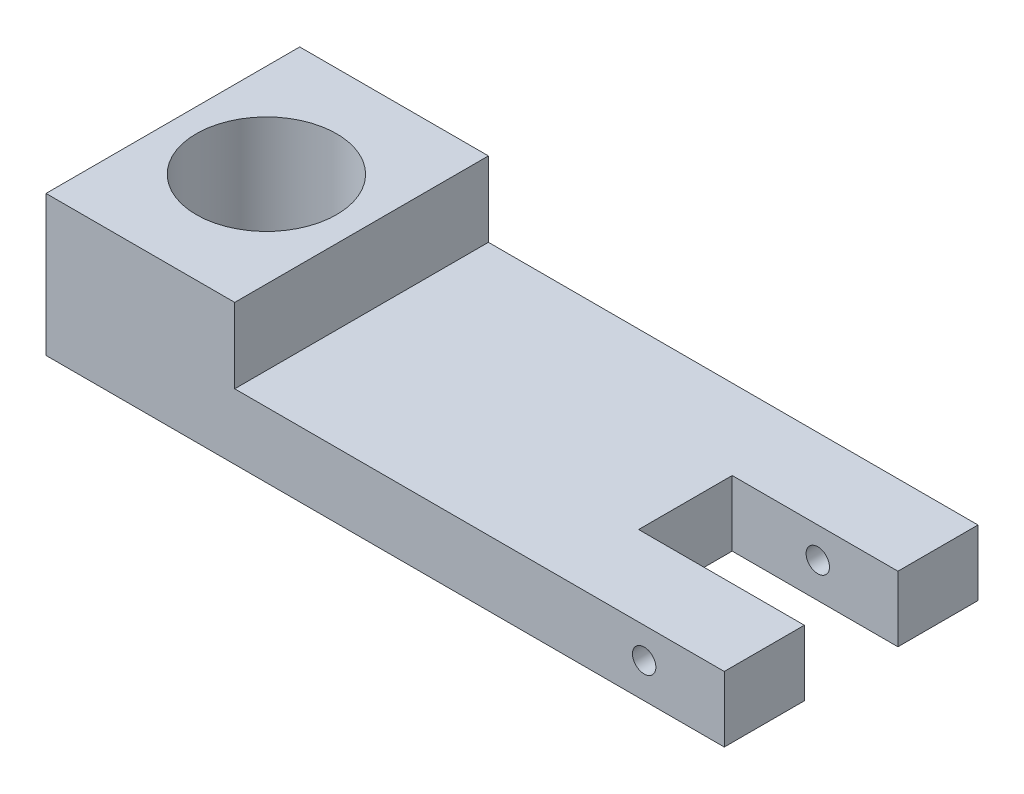
ISO-10303-21;
HEADER;
FILE_DESCRIPTION(('STEP AP214'),'2;1');
FILE_NAME('part.step','',(''),(''),'','','');
FILE_SCHEMA(('AUTOMOTIVE_DESIGN { 1 0 10303 214 1 1 1 1 }'));
ENDSEC;
DATA;
#1=APPLICATION_CONTEXT('core data for automotive mechanical design processes');
#2=APPLICATION_PROTOCOL_DEFINITION('international standard','automotive_design',2000,#1);
#3=PRODUCT_CONTEXT('',#1,'mechanical');
#4=PRODUCT('Part','Part','',(#3));
#5=PRODUCT_RELATED_PRODUCT_CATEGORY('part','',(#4));
#6=PRODUCT_DEFINITION_FORMATION('','',#4);
#7=PRODUCT_DEFINITION_CONTEXT('part definition',#1,'design');
#8=PRODUCT_DEFINITION('design','',#6,#7);
#9=PRODUCT_DEFINITION_SHAPE('','',#8);
#10=(LENGTH_UNIT() NAMED_UNIT(*) SI_UNIT(.MILLI.,.METRE.));
#11=(NAMED_UNIT(*) PLANE_ANGLE_UNIT() SI_UNIT($,.RADIAN.));
#12=(NAMED_UNIT(*) SI_UNIT($,.STERADIAN.) SOLID_ANGLE_UNIT());
#13=UNCERTAINTY_MEASURE_WITH_UNIT(LENGTH_MEASURE(1.E-05),#10,'distance_accuracy_value','');
#14=(GEOMETRIC_REPRESENTATION_CONTEXT(3) GLOBAL_UNCERTAINTY_ASSIGNED_CONTEXT((#13)) GLOBAL_UNIT_ASSIGNED_CONTEXT((#10,
#11,#12)) REPRESENTATION_CONTEXT('',''));
#15=CARTESIAN_POINT('',(0.,0.,0.));
#16=DIRECTION('',(0.,0.,1.));
#17=DIRECTION('',(1.,0.,0.));
#18=AXIS2_PLACEMENT_3D('',#15,#16,#17);
#19=CARTESIAN_POINT('',(125.,14.,27.1195704816793));
#20=DIRECTION('',(0.,1.,0.));
#21=DIRECTION('',(0.,0.,1.));
#22=AXIS2_PLACEMENT_3D('',#19,#20,#21);
#23=PLANE('',#22);
#24=DIRECTION('',(0.,0.,-1.));
#25=VECTOR('',#24,1.);
#26=CARTESIAN_POINT('',(20.3424895799387,14.,27.1195704816793));
#27=LINE('',#26,#25);
#28=CARTESIAN_POINT('',(20.3424895799387,14.,27.1195704816793));
#29=VERTEX_POINT('',#28);
#30=CARTESIAN_POINT('',(20.3424895799387,14.,-27.1195704816591));
#31=VERTEX_POINT('',#30);
#32=EDGE_CURVE('E50',#29,#31,#27,.T.);
#33=ORIENTED_EDGE('',*,*,#32,.F.);
#34=DIRECTION('',(1.,0.,0.));
#35=VECTOR('',#34,1.);
#36=CARTESIAN_POINT('',(-20.,14.,27.1195704816793));
#37=LINE('',#36,#35);
#38=CARTESIAN_POINT('',(125.,14.,27.1195704816793));
#39=VERTEX_POINT('',#38);
#40=EDGE_CURVE('E153',#29,#39,#37,.T.);
#41=ORIENTED_EDGE('',*,*,#40,.T.);
#42=DIRECTION('',(0.,0.,-1.));
#43=VECTOR('',#42,1.);
#44=CARTESIAN_POINT('',(125.,14.,-27.1195704816591));
#45=LINE('',#44,#43);
#46=CARTESIAN_POINT('',(125.,14.,9.99999999999989));
#47=VERTEX_POINT('',#46);
#48=EDGE_CURVE('E170',#39,#47,#45,.T.);
#49=ORIENTED_EDGE('',*,*,#48,.T.);
#50=DIRECTION('',(-1.,0.,0.));
#51=VECTOR('',#50,1.);
#52=CARTESIAN_POINT('',(125.,14.,9.99999999999989));
#53=LINE('',#52,#51);
#54=CARTESIAN_POINT('',(89.5690146557837,14.,9.99999999999989));
#55=VERTEX_POINT('',#54);
#56=EDGE_CURVE('E58',#47,#55,#53,.T.);
#57=ORIENTED_EDGE('',*,*,#56,.T.);
#58=DIRECTION('',(0.,0.,-1.));
#59=VECTOR('',#58,1.);
#60=CARTESIAN_POINT('',(89.5690146557837,14.,27.1195704816793));
#61=LINE('',#60,#59);
#62=CARTESIAN_POINT('',(89.5690146557837,14.,-10.0000000000001));
#63=VERTEX_POINT('',#62);
#64=EDGE_CURVE('E220',#55,#63,#61,.T.);
#65=ORIENTED_EDGE('',*,*,#64,.T.);
#66=DIRECTION('',(1.,0.,0.));
#67=VECTOR('',#66,1.);
#68=CARTESIAN_POINT('',(125.,14.,-10.0000000000001));
#69=LINE('',#68,#67);
#70=CARTESIAN_POINT('',(125.,14.,-10.0000000000001));
#71=VERTEX_POINT('',#70);
#72=EDGE_CURVE('E224',#63,#71,#69,.T.);
#73=ORIENTED_EDGE('',*,*,#72,.T.);
#74=CARTESIAN_POINT('',(125.,14.,-27.1195704816591));
#75=VERTEX_POINT('',#74);
#76=EDGE_CURVE('E185',#71,#75,#45,.T.);
#77=ORIENTED_EDGE('',*,*,#76,.T.);
#78=DIRECTION('',(-1.,0.,0.));
#79=VECTOR('',#78,1.);
#80=CARTESIAN_POINT('',(-20.,14.,-27.1195704816591));
#81=LINE('',#80,#79);
#82=EDGE_CURVE('E168',#75,#31,#81,.T.);
#83=ORIENTED_EDGE('',*,*,#82,.T.);
#84=EDGE_LOOP('',(#33,#41,#49,#57,#65,#73,#77,#83));
#85=FACE_BOUND('',#84,.T.);
#86=ADVANCED_FACE('F33',(#85),#23,.T.);
#87=CARTESIAN_POINT('',(125.,0.,27.1195704816793));
#88=DIRECTION('',(0.,1.,0.));
#89=DIRECTION('',(0.,0.,1.));
#90=AXIS2_PLACEMENT_3D('',#87,#88,#89);
#91=PLANE('',#90);
#92=CARTESIAN_POINT('',(0.,0.,0.));
#93=DIRECTION('',(0.,1.,0.));
#94=DIRECTION('',(0.,0.,1.));
#95=AXIS2_PLACEMENT_3D('',#92,#93,#94);
#96=CIRCLE('',#95,15.);
#97=CARTESIAN_POINT('',(0.,0.,15.));
#98=VERTEX_POINT('',#97);
#99=EDGE_CURVE('E218',#98,#98,#96,.T.);
#100=ORIENTED_EDGE('',*,*,#99,.T.);
#101=EDGE_LOOP('',(#100));
#102=FACE_BOUND('',#101,.T.);
#103=DIRECTION('',(-1.,0.,0.));
#104=VECTOR('',#103,1.);
#105=CARTESIAN_POINT('',(89.5690146557837,0.,-10.0000000000001));
#106=LINE('',#105,#104);
#107=CARTESIAN_POINT('',(125.,0.,-10.0000000000001));
#108=VERTEX_POINT('',#107);
#109=CARTESIAN_POINT('',(89.5690146557837,0.,-10.0000000000001));
#110=VERTEX_POINT('',#109);
#111=EDGE_CURVE('E234',#108,#110,#106,.T.);
#112=ORIENTED_EDGE('',*,*,#111,.T.);
#113=DIRECTION('',(0.,0.,1.));
#114=VECTOR('',#113,1.);
#115=CARTESIAN_POINT('',(89.5690146557837,0.,9.99999999999989));
#116=LINE('',#115,#114);
#117=CARTESIAN_POINT('',(89.5690146557837,0.,9.99999999999989));
#118=VERTEX_POINT('',#117);
#119=EDGE_CURVE('E204',#110,#118,#116,.T.);
#120=ORIENTED_EDGE('',*,*,#119,.T.);
#121=DIRECTION('',(1.,0.,0.));
#122=VECTOR('',#121,1.);
#123=CARTESIAN_POINT('',(89.5690146557837,0.,9.99999999999989));
#124=LINE('',#123,#122);
#125=CARTESIAN_POINT('',(125.,0.,9.99999999999989));
#126=VERTEX_POINT('',#125);
#127=EDGE_CURVE('E194',#118,#126,#124,.T.);
#128=ORIENTED_EDGE('',*,*,#127,.T.);
#129=DIRECTION('',(0.,0.,-1.));
#130=VECTOR('',#129,1.);
#131=CARTESIAN_POINT('',(125.,0.,-27.1195704816591));
#132=LINE('',#131,#130);
#133=CARTESIAN_POINT('',(125.,0.,27.1195704816793));
#134=VERTEX_POINT('',#133);
#135=EDGE_CURVE('E176',#134,#126,#132,.T.);
#136=ORIENTED_EDGE('',*,*,#135,.F.);
#137=DIRECTION('',(1.,0.,0.));
#138=VECTOR('',#137,1.);
#139=CARTESIAN_POINT('',(-20.,0.,27.1195704816793));
#140=LINE('',#139,#138);
#141=CARTESIAN_POINT('',(-20.,0.,27.1195704816793));
#142=VERTEX_POINT('',#141);
#143=EDGE_CURVE('E183',#142,#134,#140,.T.);
#144=ORIENTED_EDGE('',*,*,#143,.F.);
#145=DIRECTION('',(0.,0.,1.));
#146=VECTOR('',#145,1.);
#147=CARTESIAN_POINT('',(-20.,0.,-27.1195704816591));
#148=LINE('',#147,#146);
#149=CARTESIAN_POINT('',(-20.,0.,-27.1195704816591));
#150=VERTEX_POINT('',#149);
#151=EDGE_CURVE('E119',#150,#142,#148,.T.);
#152=ORIENTED_EDGE('',*,*,#151,.F.);
#153=DIRECTION('',(-1.,0.,0.));
#154=VECTOR('',#153,1.);
#155=CARTESIAN_POINT('',(-20.,0.,-27.1195704816591));
#156=LINE('',#155,#154);
#157=CARTESIAN_POINT('',(125.,0.,-27.1195704816591));
#158=VERTEX_POINT('',#157);
#159=EDGE_CURVE('E179',#158,#150,#156,.T.);
#160=ORIENTED_EDGE('',*,*,#159,.F.);
#161=EDGE_CURVE('E180',#108,#158,#132,.T.);
#162=ORIENTED_EDGE('',*,*,#161,.F.);
#163=EDGE_LOOP('',(#112,#120,#128,#136,#144,#152,#160,#162));
#164=FACE_BOUND('',#163,.T.);
#165=ADVANCED_FACE('F202',(#102,#164),#91,.F.);
#166=CARTESIAN_POINT('',(125.,14.,-27.1195704816591));
#167=DIRECTION('',(-1.,0.,0.));
#168=DIRECTION('',(0.,0.,1.));
#169=AXIS2_PLACEMENT_3D('',#166,#167,#168);
#170=PLANE('',#169);
#171=DIRECTION('',(0.,1.,0.));
#172=VECTOR('',#171,1.);
#173=CARTESIAN_POINT('',(125.,14.,-10.0000000000001));
#174=LINE('',#173,#172);
#175=EDGE_CURVE('E11',#108,#71,#174,.T.);
#176=ORIENTED_EDGE('',*,*,#175,.F.);
#177=ORIENTED_EDGE('',*,*,#161,.T.);
#178=DIRECTION('',(0.,-1.,0.));
#179=VECTOR('',#178,1.);
#180=CARTESIAN_POINT('',(125.,14.,-27.1195704816591));
#181=LINE('',#180,#179);
#182=EDGE_CURVE('E189',#75,#158,#181,.T.);
#183=ORIENTED_EDGE('',*,*,#182,.F.);
#184=ORIENTED_EDGE('',*,*,#76,.F.);
#185=EDGE_LOOP('',(#176,#177,#183,#184));
#186=FACE_BOUND('',#185,.T.);
#187=ADVANCED_FACE('F35',(#186),#170,.F.);
#188=DIRECTION('',(0.,-1.,0.));
#189=VECTOR('',#188,1.);
#190=CARTESIAN_POINT('',(125.,14.,9.99999999999989));
#191=LINE('',#190,#189);
#192=EDGE_CURVE('E42',#47,#126,#191,.T.);
#193=ORIENTED_EDGE('',*,*,#192,.F.);
#194=ORIENTED_EDGE('',*,*,#48,.F.);
#195=DIRECTION('',(0.,-1.,0.));
#196=VECTOR('',#195,1.);
#197=CARTESIAN_POINT('',(125.,14.,27.1195704816793));
#198=LINE('',#197,#196);
#199=EDGE_CURVE('E123',#39,#134,#198,.T.);
#200=ORIENTED_EDGE('',*,*,#199,.T.);
#201=ORIENTED_EDGE('',*,*,#135,.T.);
#202=EDGE_LOOP('',(#193,#194,#200,#201));
#203=FACE_BOUND('',#202,.T.);
#204=ADVANCED_FACE('F207',(#203),#170,.F.);
#205=CARTESIAN_POINT('',(-20.,14.,-27.1195704816591));
#206=DIRECTION('',(0.,0.,1.));
#207=DIRECTION('',(1.,0.,0.));
#208=AXIS2_PLACEMENT_3D('',#205,#206,#207);
#209=PLANE('',#208);
#210=CARTESIAN_POINT('',(107.871367234566,7.46112959486413,-27.1195704816591));
#211=DIRECTION('',(0.,0.,1.));
#212=DIRECTION('',(1.,0.,0.));
#213=AXIS2_PLACEMENT_3D('',#210,#211,#212);
#214=CIRCLE('',#213,2.49999999999999);
#215=CARTESIAN_POINT('',(110.371367234566,7.46112959486413,-27.1195704816591));
#216=VERTEX_POINT('',#215);
#217=EDGE_CURVE('E236',#216,#216,#214,.T.);
#218=ORIENTED_EDGE('',*,*,#217,.T.);
#219=EDGE_LOOP('',(#218));
#220=FACE_BOUND('',#219,.T.);
#221=ORIENTED_EDGE('',*,*,#159,.T.);
#222=DIRECTION('',(0.,-1.,0.));
#223=VECTOR('',#222,1.);
#224=CARTESIAN_POINT('',(-20.,14.,-27.1195704816591));
#225=LINE('',#224,#223);
#226=CARTESIAN_POINT('',(-20.,30.,-27.1195704816591));
#227=VERTEX_POINT('',#226);
#228=EDGE_CURVE('E122',#227,#150,#225,.T.);
#229=ORIENTED_EDGE('',*,*,#228,.F.);
#230=DIRECTION('',(-1.,0.,0.));
#231=VECTOR('',#230,1.);
#232=CARTESIAN_POINT('',(-20.,30.,-27.1195704816591));
#233=LINE('',#232,#231);
#234=CARTESIAN_POINT('',(20.3424895799387,30.,-27.1195704816591));
#235=VERTEX_POINT('',#234);
#236=EDGE_CURVE('E138',#235,#227,#233,.T.);
#237=ORIENTED_EDGE('',*,*,#236,.F.);
#238=DIRECTION('',(0.,-1.,0.));
#239=VECTOR('',#238,1.);
#240=CARTESIAN_POINT('',(20.3424895799387,30.,-27.1195704816591));
#241=LINE('',#240,#239);
#242=EDGE_CURVE('E146',#235,#31,#241,.T.);
#243=ORIENTED_EDGE('',*,*,#242,.T.);
#244=ORIENTED_EDGE('',*,*,#82,.F.);
#245=ORIENTED_EDGE('',*,*,#182,.T.);
#246=EDGE_LOOP('',(#221,#229,#237,#243,#244,#245));
#247=FACE_BOUND('',#246,.T.);
#248=ADVANCED_FACE('F214',(#220,#247),#209,.F.);
#249=CARTESIAN_POINT('',(-20.,14.,-27.1195704816591));
#250=DIRECTION('',(1.,0.,0.));
#251=DIRECTION('',(0.,0.,-1.));
#252=AXIS2_PLACEMENT_3D('',#249,#250,#251);
#253=PLANE('',#252);
#254=ORIENTED_EDGE('',*,*,#151,.T.);
#255=DIRECTION('',(0.,-1.,0.));
#256=VECTOR('',#255,1.);
#257=CARTESIAN_POINT('',(-20.,14.,27.1195704816793));
#258=LINE('',#257,#256);
#259=CARTESIAN_POINT('',(-20.,30.,27.1195704816793));
#260=VERTEX_POINT('',#259);
#261=EDGE_CURVE('E112',#260,#142,#258,.T.);
#262=ORIENTED_EDGE('',*,*,#261,.F.);
#263=DIRECTION('',(0.,0.,1.));
#264=VECTOR('',#263,1.);
#265=CARTESIAN_POINT('',(-20.,30.,27.1195704816793));
#266=LINE('',#265,#264);
#267=EDGE_CURVE('E117',#227,#260,#266,.T.);
#268=ORIENTED_EDGE('',*,*,#267,.F.);
#269=ORIENTED_EDGE('',*,*,#228,.T.);
#270=EDGE_LOOP('',(#254,#262,#268,#269));
#271=FACE_BOUND('',#270,.T.);
#272=ADVANCED_FACE('F114',(#271),#253,.F.);
#273=CARTESIAN_POINT('',(-20.,14.,27.1195704816793));
#274=DIRECTION('',(0.,0.,-1.));
#275=DIRECTION('',(-1.,0.,0.));
#276=AXIS2_PLACEMENT_3D('',#273,#274,#275);
#277=PLANE('',#276);
#278=CARTESIAN_POINT('',(107.871367234566,7.46112959486413,27.1195704816793));
#279=DIRECTION('',(0.,0.,-1.));
#280=DIRECTION('',(-1.,0.,0.));
#281=AXIS2_PLACEMENT_3D('',#278,#279,#280);
#282=CIRCLE('',#281,2.49999999999999);
#283=CARTESIAN_POINT('',(105.371367234566,7.46112959486413,27.1195704816793));
#284=VERTEX_POINT('',#283);
#285=EDGE_CURVE('E166',#284,#284,#282,.T.);
#286=ORIENTED_EDGE('',*,*,#285,.T.);
#287=EDGE_LOOP('',(#286));
#288=FACE_BOUND('',#287,.T.);
#289=ORIENTED_EDGE('',*,*,#143,.T.);
#290=ORIENTED_EDGE('',*,*,#199,.F.);
#291=ORIENTED_EDGE('',*,*,#40,.F.);
#292=DIRECTION('',(0.,-1.,0.));
#293=VECTOR('',#292,1.);
#294=CARTESIAN_POINT('',(20.3424895799387,30.,27.1195704816793));
#295=LINE('',#294,#293);
#296=CARTESIAN_POINT('',(20.3424895799387,30.,27.1195704816793));
#297=VERTEX_POINT('',#296);
#298=EDGE_CURVE('E129',#297,#29,#295,.T.);
#299=ORIENTED_EDGE('',*,*,#298,.F.);
#300=DIRECTION('',(1.,0.,0.));
#301=VECTOR('',#300,1.);
#302=CARTESIAN_POINT('',(-20.,30.,27.1195704816793));
#303=LINE('',#302,#301);
#304=EDGE_CURVE('E126',#260,#297,#303,.T.);
#305=ORIENTED_EDGE('',*,*,#304,.F.);
#306=ORIENTED_EDGE('',*,*,#261,.T.);
#307=EDGE_LOOP('',(#289,#290,#291,#299,#305,#306));
#308=FACE_BOUND('',#307,.T.);
#309=ADVANCED_FACE('F127',(#288,#308),#277,.F.);
#310=CARTESIAN_POINT('',(0.,14.,0.));
#311=DIRECTION('',(0.,-1.,0.));
#312=DIRECTION('',(0.,0.,-1.));
#313=AXIS2_PLACEMENT_3D('',#310,#311,#312);
#314=CYLINDRICAL_SURFACE('',#313,15.);
#315=ORIENTED_EDGE('',*,*,#99,.F.);
#316=EDGE_LOOP('',(#315));
#317=FACE_BOUND('',#316,.T.);
#318=CARTESIAN_POINT('',(0.,30.,0.));
#319=DIRECTION('',(0.,1.,0.));
#320=DIRECTION('',(0.,0.,1.));
#321=AXIS2_PLACEMENT_3D('',#318,#319,#320);
#322=CIRCLE('',#321,15.);
#323=CARTESIAN_POINT('',(0.,30.,15.));
#324=VERTEX_POINT('',#323);
#325=EDGE_CURVE('E140',#324,#324,#322,.T.);
#326=ORIENTED_EDGE('',*,*,#325,.T.);
#327=EDGE_LOOP('',(#326));
#328=FACE_BOUND('',#327,.T.);
#329=ADVANCED_FACE('F262',(#317,#328),#314,.F.);
#330=CARTESIAN_POINT('',(89.5690146557837,50.,-10.0000000000001));
#331=DIRECTION('',(0.,0.,1.));
#332=DIRECTION('',(1.,0.,0.));
#333=AXIS2_PLACEMENT_3D('',#330,#331,#332);
#334=PLANE('',#333);
#335=CARTESIAN_POINT('',(107.871367234566,7.46112959486413,-10.0000000000001));
#336=DIRECTION('',(0.,0.,1.));
#337=DIRECTION('',(1.,0.,0.));
#338=AXIS2_PLACEMENT_3D('',#335,#336,#337);
#339=CIRCLE('',#338,2.49999999999999);
#340=CARTESIAN_POINT('',(110.371367234566,7.46112959486413,-10.0000000000001));
#341=VERTEX_POINT('',#340);
#342=EDGE_CURVE('E149',#341,#341,#339,.T.);
#343=ORIENTED_EDGE('',*,*,#342,.F.);
#344=EDGE_LOOP('',(#343));
#345=FACE_BOUND('',#344,.T.);
#346=DIRECTION('',(0.,-1.,0.));
#347=VECTOR('',#346,1.);
#348=CARTESIAN_POINT('',(89.5690146557837,50.,-10.0000000000001));
#349=LINE('',#348,#347);
#350=EDGE_CURVE('E230',#63,#110,#349,.T.);
#351=ORIENTED_EDGE('',*,*,#350,.T.);
#352=ORIENTED_EDGE('',*,*,#111,.F.);
#353=ORIENTED_EDGE('',*,*,#175,.T.);
#354=ORIENTED_EDGE('',*,*,#72,.F.);
#355=EDGE_LOOP('',(#351,#352,#353,#354));
#356=FACE_BOUND('',#355,.T.);
#357=ADVANCED_FACE('F297',(#345,#356),#334,.T.);
#358=CARTESIAN_POINT('',(89.5690146557837,50.,9.99999999999989));
#359=DIRECTION('',(1.,0.,0.));
#360=DIRECTION('',(0.,0.,-1.));
#361=AXIS2_PLACEMENT_3D('',#358,#359,#360);
#362=PLANE('',#361);
#363=DIRECTION('',(0.,-1.,0.));
#364=VECTOR('',#363,1.);
#365=CARTESIAN_POINT('',(89.5690146557837,50.,9.99999999999989));
#366=LINE('',#365,#364);
#367=EDGE_CURVE('E205',#55,#118,#366,.T.);
#368=ORIENTED_EDGE('',*,*,#367,.T.);
#369=ORIENTED_EDGE('',*,*,#119,.F.);
#370=ORIENTED_EDGE('',*,*,#350,.F.);
#371=ORIENTED_EDGE('',*,*,#64,.F.);
#372=EDGE_LOOP('',(#368,#369,#370,#371));
#373=FACE_BOUND('',#372,.T.);
#374=ADVANCED_FACE('F251',(#373),#362,.T.);
#375=CARTESIAN_POINT('',(89.5690146557837,50.,9.99999999999989));
#376=DIRECTION('',(0.,0.,-1.));
#377=DIRECTION('',(-1.,0.,0.));
#378=AXIS2_PLACEMENT_3D('',#375,#376,#377);
#379=PLANE('',#378);
#380=CARTESIAN_POINT('',(107.871367234566,7.46112959486413,9.99999999999989));
#381=DIRECTION('',(0.,0.,-1.));
#382=DIRECTION('',(-1.,0.,0.));
#383=AXIS2_PLACEMENT_3D('',#380,#381,#382);
#384=CIRCLE('',#383,2.49999999999999);
#385=CARTESIAN_POINT('',(105.371367234566,7.46112959486413,9.99999999999989));
#386=VERTEX_POINT('',#385);
#387=EDGE_CURVE('E159',#386,#386,#384,.T.);
#388=ORIENTED_EDGE('',*,*,#387,.F.);
#389=EDGE_LOOP('',(#388));
#390=FACE_BOUND('',#389,.T.);
#391=ORIENTED_EDGE('',*,*,#192,.T.);
#392=ORIENTED_EDGE('',*,*,#127,.F.);
#393=ORIENTED_EDGE('',*,*,#367,.F.);
#394=ORIENTED_EDGE('',*,*,#56,.F.);
#395=EDGE_LOOP('',(#391,#392,#393,#394));
#396=FACE_BOUND('',#395,.T.);
#397=ADVANCED_FACE('F193',(#390,#396),#379,.T.);
#398=CARTESIAN_POINT('',(107.871367234566,7.46112959486413,-36.));
#399=DIRECTION('',(0.,0.,1.));
#400=DIRECTION('',(1.,0.,0.));
#401=AXIS2_PLACEMENT_3D('',#398,#399,#400);
#402=CYLINDRICAL_SURFACE('',#401,2.49999999999999);
#403=ORIENTED_EDGE('',*,*,#387,.T.);
#404=EDGE_LOOP('',(#403));
#405=FACE_BOUND('',#404,.T.);
#406=ORIENTED_EDGE('',*,*,#285,.F.);
#407=EDGE_LOOP('',(#406));
#408=FACE_BOUND('',#407,.T.);
#409=ADVANCED_FACE('F242',(#405,#408),#402,.F.);
#410=ORIENTED_EDGE('',*,*,#342,.T.);
#411=EDGE_LOOP('',(#410));
#412=FACE_BOUND('',#411,.T.);
#413=ORIENTED_EDGE('',*,*,#217,.F.);
#414=EDGE_LOOP('',(#413));
#415=FACE_BOUND('',#414,.T.);
#416=ADVANCED_FACE('F244',(#412,#415),#402,.F.);
#417=CARTESIAN_POINT('',(-20.,30.,-27.1195704816591));
#418=DIRECTION('',(0.,-1.,0.));
#419=DIRECTION('',(0.,0.,-1.));
#420=AXIS2_PLACEMENT_3D('',#417,#418,#419);
#421=PLANE('',#420);
#422=ORIENTED_EDGE('',*,*,#267,.T.);
#423=ORIENTED_EDGE('',*,*,#304,.T.);
#424=DIRECTION('',(0.,0.,-1.));
#425=VECTOR('',#424,1.);
#426=CARTESIAN_POINT('',(20.3424895799387,30.,27.1195704816793));
#427=LINE('',#426,#425);
#428=EDGE_CURVE('E132',#297,#235,#427,.T.);
#429=ORIENTED_EDGE('',*,*,#428,.T.);
#430=ORIENTED_EDGE('',*,*,#236,.T.);
#431=EDGE_LOOP('',(#422,#423,#429,#430));
#432=FACE_BOUND('',#431,.T.);
#433=ORIENTED_EDGE('',*,*,#325,.F.);
#434=EDGE_LOOP('',(#433));
#435=FACE_BOUND('',#434,.T.);
#436=ADVANCED_FACE('F135',(#432,#435),#421,.F.);
#437=CARTESIAN_POINT('',(20.3424895799387,30.,27.1195704816793));
#438=DIRECTION('',(-1.,0.,0.));
#439=DIRECTION('',(0.,0.,1.));
#440=AXIS2_PLACEMENT_3D('',#437,#438,#439);
#441=PLANE('',#440);
#442=ORIENTED_EDGE('',*,*,#32,.T.);
#443=ORIENTED_EDGE('',*,*,#242,.F.);
#444=ORIENTED_EDGE('',*,*,#428,.F.);
#445=ORIENTED_EDGE('',*,*,#298,.T.);
#446=EDGE_LOOP('',(#442,#443,#444,#445));
#447=FACE_BOUND('',#446,.T.);
#448=ADVANCED_FACE('F364',(#447),#441,.F.);
#449=CLOSED_SHELL('',(#86,#165,#187,#204,#248,#272,#309,#329,#357,#374,#397,#409,#416,#436,#448));
#450=MANIFOLD_SOLID_BREP('B2',#449);
#451=ADVANCED_BREP_SHAPE_REPRESENTATION('',(#18,#450),#14);
#452=SHAPE_DEFINITION_REPRESENTATION(#9,#451);
ENDSEC;
END-ISO-10303-21;
